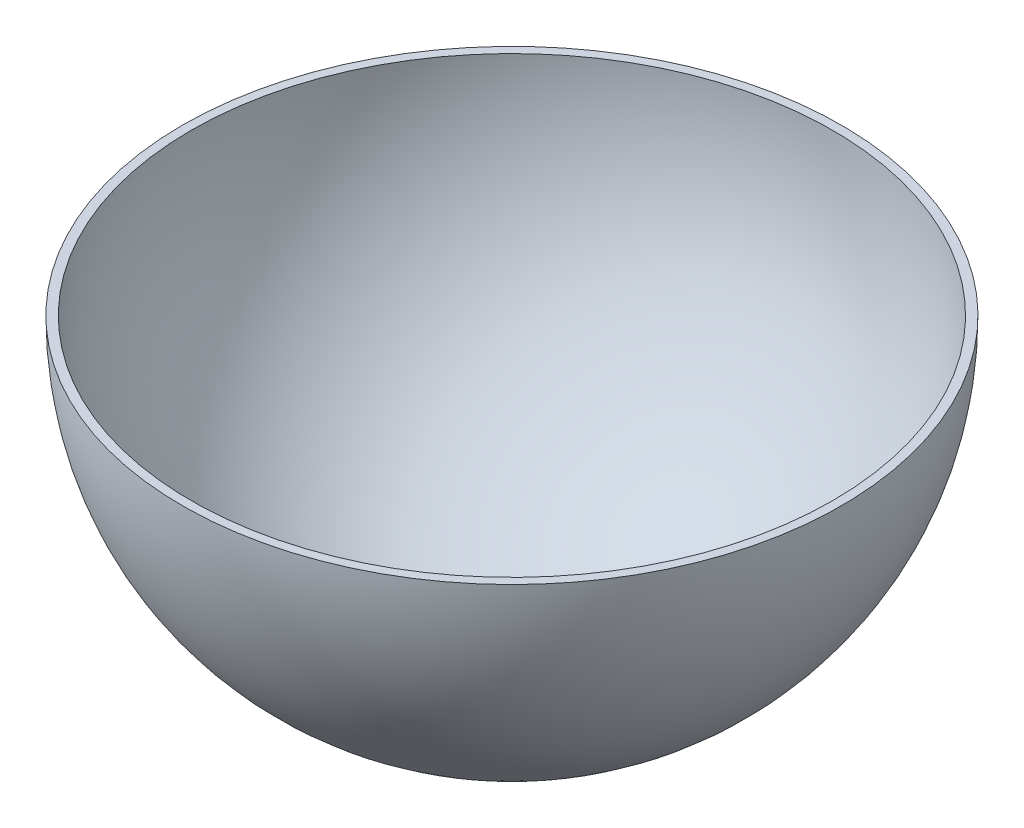
ISO-10303-21;
HEADER;
FILE_DESCRIPTION(('STEP AP214'),'2;1');
FILE_NAME('part.step','',(''),(''),'','','');
FILE_SCHEMA(('AUTOMOTIVE_DESIGN { 1 0 10303 214 1 1 1 1 }'));
ENDSEC;
DATA;
#1=APPLICATION_CONTEXT('core data for automotive mechanical design processes');
#2=APPLICATION_PROTOCOL_DEFINITION('international standard','automotive_design',2000,#1);
#3=PRODUCT_CONTEXT('',#1,'mechanical');
#4=PRODUCT('Part','Part','',(#3));
#5=PRODUCT_RELATED_PRODUCT_CATEGORY('part','',(#4));
#6=PRODUCT_DEFINITION_FORMATION('','',#4);
#7=PRODUCT_DEFINITION_CONTEXT('part definition',#1,'design');
#8=PRODUCT_DEFINITION('design','',#6,#7);
#9=PRODUCT_DEFINITION_SHAPE('','',#8);
#10=(LENGTH_UNIT() NAMED_UNIT(*) SI_UNIT(.MILLI.,.METRE.));
#11=(NAMED_UNIT(*) PLANE_ANGLE_UNIT() SI_UNIT($,.RADIAN.));
#12=(NAMED_UNIT(*) SI_UNIT($,.STERADIAN.) SOLID_ANGLE_UNIT());
#13=UNCERTAINTY_MEASURE_WITH_UNIT(LENGTH_MEASURE(1.E-05),#10,'distance_accuracy_value','');
#14=(GEOMETRIC_REPRESENTATION_CONTEXT(3) GLOBAL_UNCERTAINTY_ASSIGNED_CONTEXT((#13)) GLOBAL_UNIT_ASSIGNED_CONTEXT((#10,
#11,#12)) REPRESENTATION_CONTEXT('',''));
#15=CARTESIAN_POINT('',(0.,0.,0.));
#16=DIRECTION('',(0.,0.,1.));
#17=DIRECTION('',(1.,0.,0.));
#18=AXIS2_PLACEMENT_3D('',#15,#16,#17);
#19=CARTESIAN_POINT('',(0.,-74.2464229579385,0.));
#20=DIRECTION('',(0.,1.,0.));
#21=DIRECTION('',(-1.,0.,0.));
#22=AXIS2_PLACEMENT_3D('',#19,#20,#21);
#23=PLANE('',#22);
#24=CARTESIAN_POINT('',(0.,-74.2464229579385,0.));
#25=DIRECTION('',(0.,1.,0.));
#26=DIRECTION('',(-1.,0.,0.));
#27=AXIS2_PLACEMENT_3D('',#24,#25,#26);
#28=CIRCLE('',#27,10.6051250794554);
#29=CARTESIAN_POINT('',(-10.6051250794554,-74.2464229579385,0.));
#30=VERTEX_POINT('',#29);
#31=EDGE_CURVE('E10',#30,#30,#28,.T.);
#32=ORIENTED_EDGE('',*,*,#31,.F.);
#33=EDGE_LOOP('',(#32));
#34=FACE_BOUND('',#33,.T.);
#35=ADVANCED_FACE('F35',(#34),#23,.F.);
#36=CARTESIAN_POINT('',(0.,0.,0.));
#37=DIRECTION('',(0.,1.,0.));
#38=DIRECTION('',(1.,0.,0.));
#39=AXIS2_PLACEMENT_3D('',#36,#37,#38);
#40=SPHERICAL_SURFACE('',#39,75.);
#41=CARTESIAN_POINT('',(0.,0.,0.));
#42=DIRECTION('',(0.,1.,0.));
#43=DIRECTION('',(-1.,0.,0.));
#44=AXIS2_PLACEMENT_3D('',#41,#42,#43);
#45=CIRCLE('',#44,75.);
#46=CARTESIAN_POINT('',(-75.,0.,0.));
#47=VERTEX_POINT('',#46);
#48=EDGE_CURVE('E41',#47,#47,#45,.T.);
#49=ORIENTED_EDGE('',*,*,#48,.F.);
#50=EDGE_LOOP('',(#49));
#51=FACE_BOUND('',#50,.T.);
#52=ORIENTED_EDGE('',*,*,#31,.T.);
#53=EDGE_LOOP('',(#52));
#54=FACE_BOUND('',#53,.T.);
#55=ADVANCED_FACE('F61',(#51,#54),#40,.T.);
#56=CARTESIAN_POINT('',(0.,0.,0.));
#57=DIRECTION('',(0.,-1.,0.));
#58=DIRECTION('',(1.,0.,0.));
#59=AXIS2_PLACEMENT_3D('',#56,#57,#58);
#60=PLANE('',#59);
#61=CARTESIAN_POINT('',(0.,0.,0.));
#62=DIRECTION('',(0.,-1.,0.));
#63=DIRECTION('',(1.,0.,0.));
#64=AXIS2_PLACEMENT_3D('',#61,#62,#63);
#65=CIRCLE('',#64,73.);
#66=CARTESIAN_POINT('',(73.,0.,0.));
#67=VERTEX_POINT('',#66);
#68=EDGE_CURVE('E49',#67,#67,#65,.F.);
#69=ORIENTED_EDGE('',*,*,#68,.F.);
#70=EDGE_LOOP('',(#69));
#71=FACE_BOUND('',#70,.T.);
#72=ORIENTED_EDGE('',*,*,#48,.T.);
#73=EDGE_LOOP('',(#72));
#74=FACE_BOUND('',#73,.T.);
#75=ADVANCED_FACE('F58',(#71,#74),#60,.F.);
#76=CARTESIAN_POINT('',(0.,-72.2464229579385,0.));
#77=DIRECTION('',(0.,1.,0.));
#78=DIRECTION('',(-1.,0.,0.));
#79=AXIS2_PLACEMENT_3D('',#76,#77,#78);
#80=PLANE('',#79);
#81=CARTESIAN_POINT('',(0.,-72.2464229579385,0.));
#82=DIRECTION('',(0.,1.,0.));
#83=DIRECTION('',(-1.,0.,0.));
#84=AXIS2_PLACEMENT_3D('',#81,#82,#83);
#85=CIRCLE('',#84,10.4620442449193);
#86=CARTESIAN_POINT('',(-10.4620442449193,-72.2464229579385,0.));
#87=VERTEX_POINT('',#86);
#88=EDGE_CURVE('E45',#87,#87,#85,.T.);
#89=ORIENTED_EDGE('',*,*,#88,.T.);
#90=EDGE_LOOP('',(#89));
#91=FACE_BOUND('',#90,.T.);
#92=ADVANCED_FACE('F60',(#91),#80,.T.);
#93=CARTESIAN_POINT('',(0.,0.,0.));
#94=DIRECTION('',(0.,1.,0.));
#95=DIRECTION('',(1.,0.,0.));
#96=AXIS2_PLACEMENT_3D('',#93,#94,#95);
#97=SPHERICAL_SURFACE('',#96,73.);
#98=ORIENTED_EDGE('',*,*,#68,.T.);
#99=EDGE_LOOP('',(#98));
#100=FACE_BOUND('',#99,.T.);
#101=ORIENTED_EDGE('',*,*,#88,.F.);
#102=EDGE_LOOP('',(#101));
#103=FACE_BOUND('',#102,.T.);
#104=ADVANCED_FACE('F55',(#100,#103),#97,.F.);
#105=CLOSED_SHELL('',(#35,#55,#75,#92,#104));
#106=MANIFOLD_SOLID_BREP('B2',#105);
#107=ADVANCED_BREP_SHAPE_REPRESENTATION('',(#18,#106),#14);
#108=SHAPE_DEFINITION_REPRESENTATION(#9,#107);
ENDSEC;
END-ISO-10303-21;
